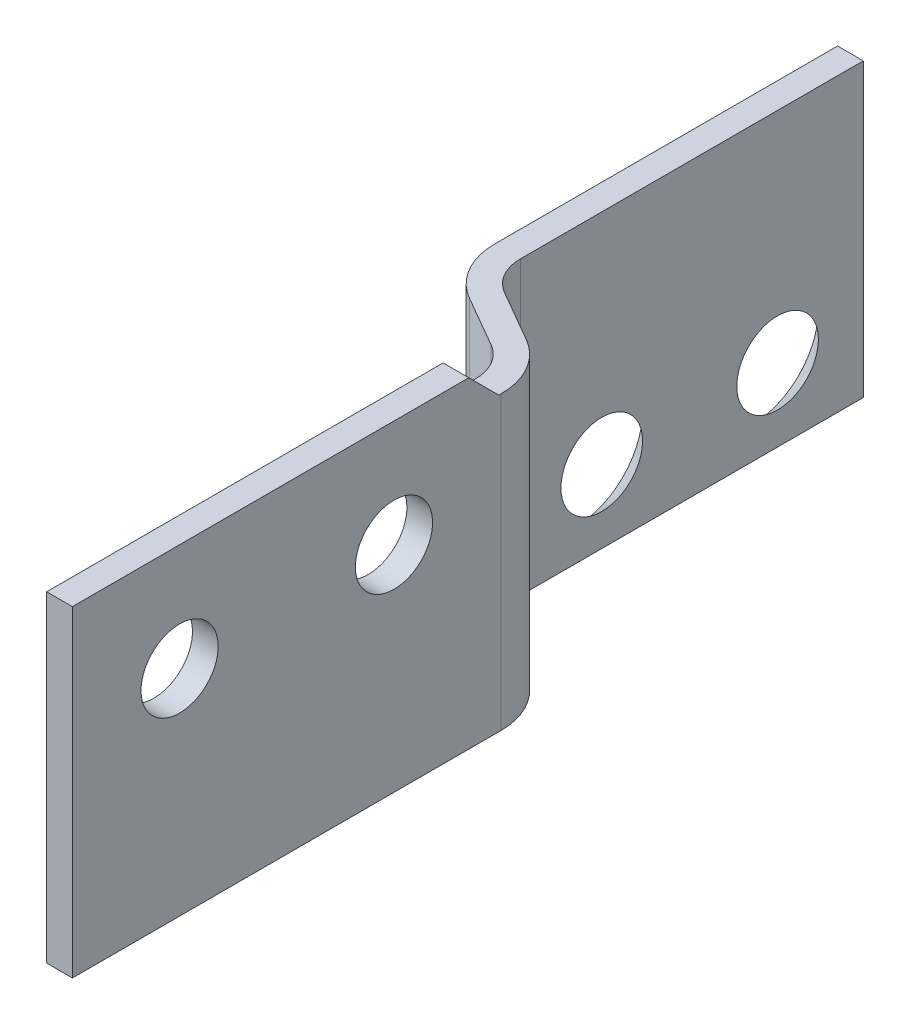
ISO-10303-21;
HEADER;
FILE_DESCRIPTION(('STEP AP214'),'2;1');
FILE_NAME('part.step','',(''),(''),'','','');
FILE_SCHEMA(('AUTOMOTIVE_DESIGN { 1 0 10303 214 1 1 1 1 }'));
ENDSEC;
DATA;
#1=APPLICATION_CONTEXT('core data for automotive mechanical design processes');
#2=APPLICATION_PROTOCOL_DEFINITION('international standard','automotive_design',2000,#1);
#3=PRODUCT_CONTEXT('',#1,'mechanical');
#4=PRODUCT('Part','Part','',(#3));
#5=PRODUCT_RELATED_PRODUCT_CATEGORY('part','',(#4));
#6=PRODUCT_DEFINITION_FORMATION('','',#4);
#7=PRODUCT_DEFINITION_CONTEXT('part definition',#1,'design');
#8=PRODUCT_DEFINITION('design','',#6,#7);
#9=PRODUCT_DEFINITION_SHAPE('','',#8);
#10=(LENGTH_UNIT() NAMED_UNIT(*) SI_UNIT(.MILLI.,.METRE.));
#11=(NAMED_UNIT(*) PLANE_ANGLE_UNIT() SI_UNIT($,.RADIAN.));
#12=(NAMED_UNIT(*) SI_UNIT($,.STERADIAN.) SOLID_ANGLE_UNIT());
#13=UNCERTAINTY_MEASURE_WITH_UNIT(LENGTH_MEASURE(1.E-05),#10,'distance_accuracy_value','');
#14=(GEOMETRIC_REPRESENTATION_CONTEXT(3) GLOBAL_UNCERTAINTY_ASSIGNED_CONTEXT((#13)) GLOBAL_UNIT_ASSIGNED_CONTEXT((#10,
#11,#12)) REPRESENTATION_CONTEXT('',''));
#15=CARTESIAN_POINT('',(0.,0.,0.));
#16=DIRECTION('',(0.,0.,1.));
#17=DIRECTION('',(1.,0.,0.));
#18=AXIS2_PLACEMENT_3D('',#15,#16,#17);
#19=CARTESIAN_POINT('',(2.,0.,10.07846096908));
#20=DIRECTION('',(-0.500000000000017,0.,0.866025403784429));
#21=DIRECTION('',(0.866025403784429,0.,0.500000000000017));
#22=AXIS2_PLACEMENT_3D('',#19,#20,#21);
#23=PLANE('',#22);
#24=DIRECTION('',(0.,-1.,0.));
#25=VECTOR('',#24,1.);
#26=CARTESIAN_POINT('',(1.99999999999759,0.,10.0784609690842));
#27=LINE('',#26,#25);
#28=CARTESIAN_POINT('',(2.00000000000001,0.,10.0784609690828));
#29=VERTEX_POINT('',#28);
#30=CARTESIAN_POINT('',(1.99999999999931,6.8,10.0784609690824));
#31=VERTEX_POINT('',#30);
#32=EDGE_CURVE('E187',#29,#31,#27,.F.);
#33=ORIENTED_EDGE('',*,*,#32,.T.);
#34=DIRECTION('',(-0.866025403785236,0.,-0.499999999998619));
#35=VECTOR('',#34,1.);
#36=CARTESIAN_POINT('',(2.,6.8,10.07846096908));
#37=LINE('',#36,#35);
#38=CARTESIAN_POINT('',(0.800000000001105,6.8,9.38564064605569));
#39=VERTEX_POINT('',#38);
#40=EDGE_CURVE('E203',#31,#39,#37,.T.);
#41=ORIENTED_EDGE('',*,*,#40,.T.);
#42=DIRECTION('',(0.,-1.,0.));
#43=VECTOR('',#42,1.);
#44=CARTESIAN_POINT('',(0.799999999999956,0.,9.38564064605508));
#45=LINE('',#44,#43);
#46=CARTESIAN_POINT('',(0.800000000000546,0.,9.38564064605407));
#47=VERTEX_POINT('',#46);
#48=EDGE_CURVE('E229',#47,#39,#45,.F.);
#49=ORIENTED_EDGE('',*,*,#48,.F.);
#50=DIRECTION('',(0.866025403784429,0.,0.500000000000017));
#51=VECTOR('',#50,1.);
#52=CARTESIAN_POINT('',(2.,0.,10.07846096908));
#53=LINE('',#52,#51);
#54=EDGE_CURVE('E237',#47,#29,#53,.T.);
#55=ORIENTED_EDGE('',*,*,#54,.T.);
#56=EDGE_LOOP('',(#33,#41,#49,#55));
#57=FACE_BOUND('',#56,.T.);
#58=ADVANCED_FACE('F17',(#57),#23,.T.);
#59=CARTESIAN_POINT('',(1.6,0.,8.));
#60=DIRECTION('',(0.,-1.,0.));
#61=DIRECTION('',(0.,0.,-1.));
#62=AXIS2_PLACEMENT_3D('',#59,#60,#61);
#63=CYLINDRICAL_SURFACE('',#62,1.6);
#64=ORIENTED_EDGE('',*,*,#48,.T.);
#65=CARTESIAN_POINT('',(1.6,6.8,8.));
#66=DIRECTION('',(0.,-1.,0.));
#67=DIRECTION('',(0.,0.,-1.));
#68=AXIS2_PLACEMENT_3D('',#65,#66,#67);
#69=CIRCLE('',#68,1.6);
#70=CARTESIAN_POINT('',(0.,6.8,8.));
#71=VERTEX_POINT('',#70);
#72=EDGE_CURVE('E205',#39,#71,#69,.T.);
#73=ORIENTED_EDGE('',*,*,#72,.T.);
#74=DIRECTION('',(0.,1.,0.));
#75=VECTOR('',#74,1.);
#76=CARTESIAN_POINT('',(0.,0.,8.));
#77=LINE('',#76,#75);
#78=CARTESIAN_POINT('',(0.,0.,8.));
#79=VERTEX_POINT('',#78);
#80=EDGE_CURVE('E181',#79,#71,#77,.T.);
#81=ORIENTED_EDGE('',*,*,#80,.F.);
#82=CARTESIAN_POINT('',(1.6,0.,8.));
#83=DIRECTION('',(0.,-1.,0.));
#84=DIRECTION('',(0.,0.,-1.));
#85=AXIS2_PLACEMENT_3D('',#82,#83,#84);
#86=CIRCLE('',#85,1.6);
#87=EDGE_CURVE('E20',#79,#47,#86,.F.);
#88=ORIENTED_EDGE('',*,*,#87,.T.);
#89=EDGE_LOOP('',(#64,#73,#81,#88));
#90=FACE_BOUND('',#89,.T.);
#91=ADVANCED_FACE('F332',(#90),#63,.T.);
#92=CARTESIAN_POINT('',(0.,0.,0.));
#93=DIRECTION('',(0.,0.,-1.));
#94=DIRECTION('',(-1.,0.,0.));
#95=AXIS2_PLACEMENT_3D('',#92,#93,#94);
#96=PLANE('',#95);
#97=DIRECTION('',(0.,1.,0.));
#98=VECTOR('',#97,1.);
#99=CARTESIAN_POINT('',(0.,0.,0.));
#100=LINE('',#99,#98);
#101=CARTESIAN_POINT('',(0.,6.8,0.));
#102=VERTEX_POINT('',#101);
#103=CARTESIAN_POINT('',(0.,0.,0.));
#104=VERTEX_POINT('',#103);
#105=EDGE_CURVE('E185',#102,#104,#100,.F.);
#106=ORIENTED_EDGE('',*,*,#105,.F.);
#107=DIRECTION('',(1.,0.,0.));
#108=VECTOR('',#107,1.);
#109=CARTESIAN_POINT('',(0.,6.8,0.));
#110=LINE('',#109,#108);
#111=CARTESIAN_POINT('',(0.6,6.8,0.));
#112=VERTEX_POINT('',#111);
#113=EDGE_CURVE('E223',#102,#112,#110,.T.);
#114=ORIENTED_EDGE('',*,*,#113,.T.);
#115=DIRECTION('',(0.,1.,0.));
#116=VECTOR('',#115,1.);
#117=CARTESIAN_POINT('',(0.6,0.,0.));
#118=LINE('',#117,#116);
#119=CARTESIAN_POINT('',(0.6,0.,0.));
#120=VERTEX_POINT('',#119);
#121=EDGE_CURVE('E174',#120,#112,#118,.T.);
#122=ORIENTED_EDGE('',*,*,#121,.F.);
#123=DIRECTION('',(-1.,0.,0.));
#124=VECTOR('',#123,1.);
#125=CARTESIAN_POINT('',(0.,0.,0.));
#126=LINE('',#125,#124);
#127=EDGE_CURVE('E100',#120,#104,#126,.T.);
#128=ORIENTED_EDGE('',*,*,#127,.T.);
#129=EDGE_LOOP('',(#106,#114,#122,#128));
#130=FACE_BOUND('',#129,.T.);
#131=ADVANCED_FACE('F398',(#130),#96,.T.);
#132=CARTESIAN_POINT('',(0.,6.8,0.));
#133=DIRECTION('',(0.,-1.,0.));
#134=DIRECTION('',(0.,0.,-1.));
#135=AXIS2_PLACEMENT_3D('',#132,#133,#134);
#136=PLANE('',#135);
#137=DIRECTION('',(0.,0.,-1.));
#138=VECTOR('',#137,1.);
#139=CARTESIAN_POINT('',(0.6,6.8,0.));
#140=LINE('',#139,#138);
#141=CARTESIAN_POINT('',(0.6,6.8,8.));
#142=VERTEX_POINT('',#141);
#143=EDGE_CURVE('E178',#112,#142,#140,.F.);
#144=ORIENTED_EDGE('',*,*,#143,.F.);
#145=ORIENTED_EDGE('',*,*,#113,.F.);
#146=DIRECTION('',(0.,0.,1.));
#147=VECTOR('',#146,1.);
#148=CARTESIAN_POINT('',(0.,6.8,8.));
#149=LINE('',#148,#147);
#150=EDGE_CURVE('E184',#71,#102,#149,.F.);
#151=ORIENTED_EDGE('',*,*,#150,.F.);
#152=ORIENTED_EDGE('',*,*,#72,.F.);
#153=ORIENTED_EDGE('',*,*,#40,.F.);
#154=CARTESIAN_POINT('',(1.5,6.8,10.94448637287));
#155=DIRECTION('',(0.,-1.,0.));
#156=DIRECTION('',(0.,0.,-1.));
#157=AXIS2_PLACEMENT_3D('',#154,#155,#156);
#158=CIRCLE('',#157,1.);
#159=CARTESIAN_POINT('',(2.5,6.8,10.94448637287));
#160=VERTEX_POINT('',#159);
#161=EDGE_CURVE('E266',#31,#160,#158,.T.);
#162=ORIENTED_EDGE('',*,*,#161,.T.);
#163=DIRECTION('',(0.,0.,-1.));
#164=VECTOR('',#163,1.);
#165=CARTESIAN_POINT('',(2.5,6.8,0.));
#166=LINE('',#165,#164);
#167=CARTESIAN_POINT('',(2.5,6.8,11.));
#168=VERTEX_POINT('',#167);
#169=EDGE_CURVE('E206',#168,#160,#166,.T.);
#170=ORIENTED_EDGE('',*,*,#169,.F.);
#171=DIRECTION('',(1.,0.,0.));
#172=VECTOR('',#171,1.);
#173=CARTESIAN_POINT('',(0.,6.8,11.));
#174=LINE('',#173,#172);
#175=CARTESIAN_POINT('',(3.1,6.8,11.));
#176=VERTEX_POINT('',#175);
#177=EDGE_CURVE('E208',#176,#168,#174,.F.);
#178=ORIENTED_EDGE('',*,*,#177,.F.);
#179=DIRECTION('',(0.,0.,-1.));
#180=VECTOR('',#179,1.);
#181=CARTESIAN_POINT('',(3.1,6.8,0.));
#182=LINE('',#181,#180);
#183=CARTESIAN_POINT('',(3.1,6.8,10.94448637287));
#184=VERTEX_POINT('',#183);
#185=EDGE_CURVE('E211',#184,#176,#182,.F.);
#186=ORIENTED_EDGE('',*,*,#185,.F.);
#187=CARTESIAN_POINT('',(1.5,6.8,10.94448637287));
#188=DIRECTION('',(0.,-1.,0.));
#189=DIRECTION('',(0.,0.,-1.));
#190=AXIS2_PLACEMENT_3D('',#187,#188,#189);
#191=CIRCLE('',#190,1.6);
#192=CARTESIAN_POINT('',(2.3000000000002,6.8,9.55884572681356));
#193=VERTEX_POINT('',#192);
#194=EDGE_CURVE('E213',#193,#184,#191,.T.);
#195=ORIENTED_EDGE('',*,*,#194,.F.);
#196=DIRECTION('',(0.866025403784298,0.,0.500000000000243));
#197=VECTOR('',#196,1.);
#198=CARTESIAN_POINT('',(1.1,6.8,8.866025403784));
#199=LINE('',#198,#197);
#200=CARTESIAN_POINT('',(1.09999999999997,6.8,8.86602540378398));
#201=VERTEX_POINT('',#200);
#202=EDGE_CURVE('E216',#201,#193,#199,.T.);
#203=ORIENTED_EDGE('',*,*,#202,.F.);
#204=CARTESIAN_POINT('',(1.6,6.8,8.));
#205=DIRECTION('',(0.,-1.,0.));
#206=DIRECTION('',(0.,0.,-1.));
#207=AXIS2_PLACEMENT_3D('',#204,#205,#206);
#208=CIRCLE('',#207,1.);
#209=EDGE_CURVE('E225',#201,#142,#208,.T.);
#210=ORIENTED_EDGE('',*,*,#209,.T.);
#211=EDGE_LOOP('',(#144,#145,#151,#152,#153,#162,#170,#178,#186,#195,#203,#210));
#212=FACE_BOUND('',#211,.T.);
#213=ADVANCED_FACE('F281',(#212),#136,.F.);
#214=CARTESIAN_POINT('',(0.000901587725365971,1.7,2.));
#215=DIRECTION('',(-1.,0.,0.));
#216=DIRECTION('',(0.,0.,1.));
#217=AXIS2_PLACEMENT_3D('',#214,#215,#216);
#218=CONICAL_SURFACE('',#217,1.5508943024447,0.785977484061561);
#219=CARTESIAN_POINT('',(0.,1.7,2.));
#220=DIRECTION('',(-1.,0.,0.));
#221=DIRECTION('',(0.,0.,1.));
#222=AXIS2_PLACEMENT_3D('',#219,#220,#221);
#223=CIRCLE('',#222,1.5517969353925);
#224=CARTESIAN_POINT('',(0.,1.7,3.55179693539251));
#225=VERTEX_POINT('',#224);
#226=EDGE_CURVE('E234',#225,#225,#223,.F.);
#227=ORIENTED_EDGE('',*,*,#226,.F.);
#228=EDGE_LOOP('',(#227));
#229=FACE_BOUND('',#228,.T.);
#230=CARTESIAN_POINT('',(0.600000000019918,1.7,2.));
#231=DIRECTION('',(-1.,0.,0.));
#232=DIRECTION('',(0.,0.,1.));
#233=AXIS2_PLACEMENT_3D('',#230,#231,#232);
#234=CIRCLE('',#233,0.951101347529402);
#235=CARTESIAN_POINT('',(0.600000000019918,1.7,2.9511013475294));
#236=VERTEX_POINT('',#235);
#237=EDGE_CURVE('E220',#236,#236,#234,.T.);
#238=ORIENTED_EDGE('',*,*,#237,.F.);
#239=EDGE_LOOP('',(#238));
#240=FACE_BOUND('',#239,.T.);
#241=ADVANCED_FACE('F388',(#229,#240),#218,.F.);
#242=CARTESIAN_POINT('',(0.000901587668522552,1.7,6.1));
#243=DIRECTION('',(-1.,0.,0.));
#244=DIRECTION('',(0.,0.,1.));
#245=AXIS2_PLACEMENT_3D('',#242,#243,#244);
#246=CONICAL_SURFACE('',#245,1.55089430250755,0.785977484061396);
#247=CARTESIAN_POINT('',(0.,1.7,6.1));
#248=DIRECTION('',(-1.,0.,0.));
#249=DIRECTION('',(0.,0.,1.));
#250=AXIS2_PLACEMENT_3D('',#247,#248,#249);
#251=CIRCLE('',#250,1.55179693539844);
#252=CARTESIAN_POINT('',(0.,1.7,7.65179693539844));
#253=VERTEX_POINT('',#252);
#254=EDGE_CURVE('E175',#253,#253,#251,.F.);
#255=ORIENTED_EDGE('',*,*,#254,.F.);
#256=EDGE_LOOP('',(#255));
#257=FACE_BOUND('',#256,.T.);
#258=CARTESIAN_POINT('',(0.600000000076827,1.7,6.1));
#259=DIRECTION('',(-1.,0.,0.));
#260=DIRECTION('',(0.,0.,1.));
#261=AXIS2_PLACEMENT_3D('',#258,#259,#260);
#262=CIRCLE('',#261,0.951101347478561);
#263=CARTESIAN_POINT('',(0.600000000076827,1.7,7.05110134747856));
#264=VERTEX_POINT('',#263);
#265=EDGE_CURVE('E170',#264,#264,#262,.T.);
#266=ORIENTED_EDGE('',*,*,#265,.F.);
#267=EDGE_LOOP('',(#266));
#268=FACE_BOUND('',#267,.T.);
#269=ADVANCED_FACE('F348',(#257,#268),#246,.F.);
#270=CARTESIAN_POINT('',(1.6,0.,8.));
#271=DIRECTION('',(0.,-1.,0.));
#272=DIRECTION('',(0.,0.,-1.));
#273=AXIS2_PLACEMENT_3D('',#270,#271,#272);
#274=CYLINDRICAL_SURFACE('',#273,1.);
#275=CARTESIAN_POINT('',(1.6,0.,8.));
#276=DIRECTION('',(0.,-1.,0.));
#277=DIRECTION('',(0.,0.,-1.));
#278=AXIS2_PLACEMENT_3D('',#275,#276,#277);
#279=CIRCLE('',#278,1.);
#280=CARTESIAN_POINT('',(0.6,0.,8.));
#281=VERTEX_POINT('',#280);
#282=CARTESIAN_POINT('',(1.09999999999997,0.,8.86602540378398));
#283=VERTEX_POINT('',#282);
#284=EDGE_CURVE('E269',#281,#283,#279,.F.);
#285=ORIENTED_EDGE('',*,*,#284,.F.);
#286=DIRECTION('',(0.,1.,0.));
#287=VECTOR('',#286,1.);
#288=CARTESIAN_POINT('',(0.6,0.,8.));
#289=LINE('',#288,#287);
#290=EDGE_CURVE('E171',#142,#281,#289,.F.);
#291=ORIENTED_EDGE('',*,*,#290,.F.);
#292=ORIENTED_EDGE('',*,*,#209,.F.);
#293=DIRECTION('',(0.,1.,0.));
#294=VECTOR('',#293,1.);
#295=CARTESIAN_POINT('',(1.1,0.,8.866025403784));
#296=LINE('',#295,#294);
#297=EDGE_CURVE('E166',#283,#201,#296,.T.);
#298=ORIENTED_EDGE('',*,*,#297,.F.);
#299=EDGE_LOOP('',(#285,#291,#292,#298));
#300=FACE_BOUND('',#299,.T.);
#301=ADVANCED_FACE('F321',(#300),#274,.F.);
#302=CARTESIAN_POINT('',(1.5,0.,10.94448637287));
#303=DIRECTION('',(0.,-1.,0.));
#304=DIRECTION('',(0.,0.,-1.));
#305=AXIS2_PLACEMENT_3D('',#302,#303,#304);
#306=CYLINDRICAL_SURFACE('',#305,1.);
#307=CARTESIAN_POINT('',(1.5,0.,10.94448637287));
#308=DIRECTION('',(0.,-1.,0.));
#309=DIRECTION('',(0.,0.,-1.));
#310=AXIS2_PLACEMENT_3D('',#307,#308,#309);
#311=CIRCLE('',#310,1.);
#312=CARTESIAN_POINT('',(2.5,0.,10.94448637287));
#313=VERTEX_POINT('',#312);
#314=EDGE_CURVE('E242',#313,#29,#311,.F.);
#315=ORIENTED_EDGE('',*,*,#314,.F.);
#316=DIRECTION('',(0.,1.,0.));
#317=VECTOR('',#316,1.);
#318=CARTESIAN_POINT('',(2.5,0.,10.94448637287));
#319=LINE('',#318,#317);
#320=EDGE_CURVE('E169',#160,#313,#319,.F.);
#321=ORIENTED_EDGE('',*,*,#320,.F.);
#322=ORIENTED_EDGE('',*,*,#161,.F.);
#323=ORIENTED_EDGE('',*,*,#32,.F.);
#324=EDGE_LOOP('',(#315,#321,#322,#323));
#325=FACE_BOUND('',#324,.T.);
#326=ADVANCED_FACE('F338',(#325),#306,.F.);
#327=CARTESIAN_POINT('',(0.,0.,8.));
#328=DIRECTION('',(-1.,0.,0.));
#329=DIRECTION('',(0.,0.,1.));
#330=AXIS2_PLACEMENT_3D('',#327,#328,#329);
#331=PLANE('',#330);
#332=ORIENTED_EDGE('',*,*,#254,.T.);
#333=EDGE_LOOP('',(#332));
#334=FACE_BOUND('',#333,.T.);
#335=ORIENTED_EDGE('',*,*,#226,.T.);
#336=EDGE_LOOP('',(#335));
#337=FACE_BOUND('',#336,.T.);
#338=ORIENTED_EDGE('',*,*,#80,.T.);
#339=ORIENTED_EDGE('',*,*,#150,.T.);
#340=ORIENTED_EDGE('',*,*,#105,.T.);
#341=DIRECTION('',(0.,0.,-1.));
#342=VECTOR('',#341,1.);
#343=CARTESIAN_POINT('',(0.,0.,0.));
#344=LINE('',#343,#342);
#345=EDGE_CURVE('E292',#79,#104,#344,.T.);
#346=ORIENTED_EDGE('',*,*,#345,.F.);
#347=EDGE_LOOP('',(#338,#339,#340,#346));
#348=FACE_BOUND('',#347,.T.);
#349=ADVANCED_FACE('F329',(#334,#337,#348),#331,.T.);
#350=CARTESIAN_POINT('',(0.6,0.,0.));
#351=DIRECTION('',(1.,0.,0.));
#352=DIRECTION('',(0.,0.,-1.));
#353=AXIS2_PLACEMENT_3D('',#350,#351,#352);
#354=PLANE('',#353);
#355=ORIENTED_EDGE('',*,*,#265,.T.);
#356=EDGE_LOOP('',(#355));
#357=FACE_BOUND('',#356,.T.);
#358=ORIENTED_EDGE('',*,*,#237,.T.);
#359=EDGE_LOOP('',(#358));
#360=FACE_BOUND('',#359,.T.);
#361=ORIENTED_EDGE('',*,*,#121,.T.);
#362=ORIENTED_EDGE('',*,*,#143,.T.);
#363=ORIENTED_EDGE('',*,*,#290,.T.);
#364=DIRECTION('',(0.,0.,-1.));
#365=VECTOR('',#364,1.);
#366=CARTESIAN_POINT('',(0.6,0.,0.));
#367=LINE('',#366,#365);
#368=EDGE_CURVE('E309',#120,#281,#367,.F.);
#369=ORIENTED_EDGE('',*,*,#368,.F.);
#370=EDGE_LOOP('',(#361,#362,#363,#369));
#371=FACE_BOUND('',#370,.T.);
#372=ADVANCED_FACE('F324',(#357,#360,#371),#354,.T.);
#373=CARTESIAN_POINT('',(1.1,0.,8.866025403784));
#374=DIRECTION('',(0.500000000000017,0.,-0.866025403784429));
#375=DIRECTION('',(-0.866025403784429,0.,-0.500000000000017));
#376=AXIS2_PLACEMENT_3D('',#373,#374,#375);
#377=PLANE('',#376);
#378=ORIENTED_EDGE('',*,*,#297,.T.);
#379=ORIENTED_EDGE('',*,*,#202,.T.);
#380=DIRECTION('',(0.,-1.,0.));
#381=VECTOR('',#380,1.);
#382=CARTESIAN_POINT('',(2.29999999999875,0.,9.55884572681417));
#383=LINE('',#382,#381);
#384=CARTESIAN_POINT('',(2.3000000000002,0.,9.55884572681356));
#385=VERTEX_POINT('',#384);
#386=EDGE_CURVE('E162',#385,#193,#383,.F.);
#387=ORIENTED_EDGE('',*,*,#386,.F.);
#388=DIRECTION('',(0.866025403784298,0.,0.500000000000243));
#389=VECTOR('',#388,1.);
#390=CARTESIAN_POINT('',(1.1,0.,8.866025403784));
#391=LINE('',#390,#389);
#392=EDGE_CURVE('E256',#283,#385,#391,.T.);
#393=ORIENTED_EDGE('',*,*,#392,.F.);
#394=EDGE_LOOP('',(#378,#379,#387,#393));
#395=FACE_BOUND('',#394,.T.);
#396=ADVANCED_FACE('F317',(#395),#377,.T.);
#397=CARTESIAN_POINT('',(2.5,0.,20.94448637287));
#398=DIRECTION('',(-1.,0.,0.));
#399=DIRECTION('',(0.,0.,1.));
#400=AXIS2_PLACEMENT_3D('',#397,#398,#399);
#401=PLANE('',#400);
#402=CARTESIAN_POINT('',(2.5,5.,13.44448637287));
#403=DIRECTION('',(-1.,0.,0.));
#404=DIRECTION('',(0.,0.,1.));
#405=AXIS2_PLACEMENT_3D('',#402,#403,#404);
#406=CIRCLE('',#405,0.9);
#407=CARTESIAN_POINT('',(2.5,5.,14.34448637287));
#408=VERTEX_POINT('',#407);
#409=EDGE_CURVE('E149',#408,#408,#406,.F.);
#410=ORIENTED_EDGE('',*,*,#409,.T.);
#411=EDGE_LOOP('',(#410));
#412=FACE_BOUND('',#411,.T.);
#413=CARTESIAN_POINT('',(2.5,5.,18.44448637287));
#414=DIRECTION('',(-1.,0.,0.));
#415=DIRECTION('',(0.,0.,1.));
#416=AXIS2_PLACEMENT_3D('',#413,#414,#415);
#417=CIRCLE('',#416,0.9);
#418=CARTESIAN_POINT('',(2.5,5.,19.34448637287));
#419=VERTEX_POINT('',#418);
#420=EDGE_CURVE('E165',#419,#419,#417,.F.);
#421=ORIENTED_EDGE('',*,*,#420,.T.);
#422=EDGE_LOOP('',(#421));
#423=FACE_BOUND('',#422,.T.);
#424=DIRECTION('',(0.,-0.707106781186548,-0.707106781186548));
#425=VECTOR('',#424,1.);
#426=CARTESIAN_POINT('',(2.5,6.8,11.));
#427=LINE('',#426,#425);
#428=CARTESIAN_POINT('',(2.5,7.5,11.7));
#429=VERTEX_POINT('',#428);
#430=EDGE_CURVE('E192',#429,#168,#427,.T.);
#431=ORIENTED_EDGE('',*,*,#430,.T.);
#432=ORIENTED_EDGE('',*,*,#169,.T.);
#433=ORIENTED_EDGE('',*,*,#320,.T.);
#434=DIRECTION('',(0.,0.,-1.));
#435=VECTOR('',#434,1.);
#436=CARTESIAN_POINT('',(2.5,0.,0.));
#437=LINE('',#436,#435);
#438=CARTESIAN_POINT('',(2.5,0.,20.94448637287));
#439=VERTEX_POINT('',#438);
#440=EDGE_CURVE('E290',#439,#313,#437,.T.);
#441=ORIENTED_EDGE('',*,*,#440,.F.);
#442=DIRECTION('',(0.,1.,0.));
#443=VECTOR('',#442,1.);
#444=CARTESIAN_POINT('',(2.5,0.,20.94448637287));
#445=LINE('',#444,#443);
#446=CARTESIAN_POINT('',(2.5,7.5,20.94448637287));
#447=VERTEX_POINT('',#446);
#448=EDGE_CURVE('E134',#447,#439,#445,.F.);
#449=ORIENTED_EDGE('',*,*,#448,.F.);
#450=DIRECTION('',(0.,0.,-1.));
#451=VECTOR('',#450,1.);
#452=CARTESIAN_POINT('',(2.5,7.5,11.7));
#453=LINE('',#452,#451);
#454=EDGE_CURVE('E131',#447,#429,#453,.T.);
#455=ORIENTED_EDGE('',*,*,#454,.T.);
#456=EDGE_LOOP('',(#431,#432,#433,#441,#449,#455));
#457=FACE_BOUND('',#456,.T.);
#458=ADVANCED_FACE('F287',(#412,#423,#457),#401,.T.);
#459=CARTESIAN_POINT('',(0.,6.8,11.));
#460=DIRECTION('',(0.,-0.707106781186548,0.707106781186548));
#461=DIRECTION('',(0.,-0.707106781186548,-0.707106781186548));
#462=AXIS2_PLACEMENT_3D('',#459,#460,#461);
#463=PLANE('',#462);
#464=ORIENTED_EDGE('',*,*,#430,.F.);
#465=DIRECTION('',(1.,0.,0.));
#466=VECTOR('',#465,1.);
#467=CARTESIAN_POINT('',(0.,7.5,11.7));
#468=LINE('',#467,#466);
#469=CARTESIAN_POINT('',(3.1,7.5,11.7));
#470=VERTEX_POINT('',#469);
#471=EDGE_CURVE('E156',#429,#470,#468,.T.);
#472=ORIENTED_EDGE('',*,*,#471,.T.);
#473=DIRECTION('',(0.,0.707106781186547,0.707106781186548));
#474=VECTOR('',#473,1.);
#475=CARTESIAN_POINT('',(3.1,6.8,11.));
#476=LINE('',#475,#474);
#477=EDGE_CURVE('E147',#176,#470,#476,.T.);
#478=ORIENTED_EDGE('',*,*,#477,.F.);
#479=ORIENTED_EDGE('',*,*,#177,.T.);
#480=EDGE_LOOP('',(#464,#472,#478,#479));
#481=FACE_BOUND('',#480,.T.);
#482=ADVANCED_FACE('F285',(#481),#463,.F.);
#483=CARTESIAN_POINT('',(0.,7.5,11.7));
#484=DIRECTION('',(0.,-1.,0.));
#485=DIRECTION('',(0.,0.,-1.));
#486=AXIS2_PLACEMENT_3D('',#483,#484,#485);
#487=PLANE('',#486);
#488=ORIENTED_EDGE('',*,*,#454,.F.);
#489=DIRECTION('',(1.,0.,0.));
#490=VECTOR('',#489,1.);
#491=CARTESIAN_POINT('',(3.1,7.5,20.94448637287));
#492=LINE('',#491,#490);
#493=CARTESIAN_POINT('',(3.1,7.5,20.94448637287));
#494=VERTEX_POINT('',#493);
#495=EDGE_CURVE('E124',#494,#447,#492,.F.);
#496=ORIENTED_EDGE('',*,*,#495,.F.);
#497=DIRECTION('',(0.,0.,-1.));
#498=VECTOR('',#497,1.);
#499=CARTESIAN_POINT('',(3.1,7.5,10.94448637287));
#500=LINE('',#499,#498);
#501=EDGE_CURVE('E129',#470,#494,#500,.F.);
#502=ORIENTED_EDGE('',*,*,#501,.F.);
#503=ORIENTED_EDGE('',*,*,#471,.F.);
#504=EDGE_LOOP('',(#488,#496,#502,#503));
#505=FACE_BOUND('',#504,.T.);
#506=ADVANCED_FACE('F126',(#505),#487,.F.);
#507=CARTESIAN_POINT('',(3.1,0.,20.94448637287));
#508=DIRECTION('',(0.,0.,1.));
#509=DIRECTION('',(1.,0.,0.));
#510=AXIS2_PLACEMENT_3D('',#507,#508,#509);
#511=PLANE('',#510);
#512=DIRECTION('',(0.,1.,0.));
#513=VECTOR('',#512,1.);
#514=CARTESIAN_POINT('',(3.1,0.,20.94448637287));
#515=LINE('',#514,#513);
#516=CARTESIAN_POINT('',(3.1,0.,20.94448637287));
#517=VERTEX_POINT('',#516);
#518=EDGE_CURVE('E137',#494,#517,#515,.F.);
#519=ORIENTED_EDGE('',*,*,#518,.F.);
#520=ORIENTED_EDGE('',*,*,#495,.T.);
#521=ORIENTED_EDGE('',*,*,#448,.T.);
#522=DIRECTION('',(1.,0.,0.));
#523=VECTOR('',#522,1.);
#524=CARTESIAN_POINT('',(0.,0.,20.94448637287));
#525=LINE('',#524,#523);
#526=EDGE_CURVE('E133',#517,#439,#525,.F.);
#527=ORIENTED_EDGE('',*,*,#526,.F.);
#528=EDGE_LOOP('',(#519,#520,#521,#527));
#529=FACE_BOUND('',#528,.T.);
#530=ADVANCED_FACE('F138',(#529),#511,.T.);
#531=CARTESIAN_POINT('',(0.,0.,0.));
#532=DIRECTION('',(0.,-1.,0.));
#533=DIRECTION('',(0.,0.,-1.));
#534=AXIS2_PLACEMENT_3D('',#531,#532,#533);
#535=PLANE('',#534);
#536=ORIENTED_EDGE('',*,*,#284,.T.);
#537=ORIENTED_EDGE('',*,*,#392,.T.);
#538=CARTESIAN_POINT('',(1.5,0.,10.94448637287));
#539=DIRECTION('',(0.,-1.,0.));
#540=DIRECTION('',(0.,0.,-1.));
#541=AXIS2_PLACEMENT_3D('',#538,#539,#540);
#542=CIRCLE('',#541,1.6);
#543=CARTESIAN_POINT('',(3.1,0.,10.94448637287));
#544=VERTEX_POINT('',#543);
#545=EDGE_CURVE('E35',#544,#385,#542,.F.);
#546=ORIENTED_EDGE('',*,*,#545,.F.);
#547=DIRECTION('',(0.,0.,-1.));
#548=VECTOR('',#547,1.);
#549=CARTESIAN_POINT('',(3.1,0.,10.94448637287));
#550=LINE('',#549,#548);
#551=EDGE_CURVE('E142',#517,#544,#550,.T.);
#552=ORIENTED_EDGE('',*,*,#551,.F.);
#553=ORIENTED_EDGE('',*,*,#526,.T.);
#554=ORIENTED_EDGE('',*,*,#440,.T.);
#555=ORIENTED_EDGE('',*,*,#314,.T.);
#556=ORIENTED_EDGE('',*,*,#54,.F.);
#557=ORIENTED_EDGE('',*,*,#87,.F.);
#558=ORIENTED_EDGE('',*,*,#345,.T.);
#559=ORIENTED_EDGE('',*,*,#127,.F.);
#560=ORIENTED_EDGE('',*,*,#368,.T.);
#561=EDGE_LOOP('',(#536,#537,#546,#552,#553,#554,#555,#556,#557,#558,#559,#560));
#562=FACE_BOUND('',#561,.T.);
#563=ADVANCED_FACE('F294',(#562),#535,.T.);
#564=CARTESIAN_POINT('',(1.5,0.,10.94448637287));
#565=DIRECTION('',(0.,-1.,0.));
#566=DIRECTION('',(0.,0.,-1.));
#567=AXIS2_PLACEMENT_3D('',#564,#565,#566);
#568=CYLINDRICAL_SURFACE('',#567,1.6);
#569=ORIENTED_EDGE('',*,*,#386,.T.);
#570=ORIENTED_EDGE('',*,*,#194,.T.);
#571=DIRECTION('',(0.,1.,0.));
#572=VECTOR('',#571,1.);
#573=CARTESIAN_POINT('',(3.1,0.,10.94448637287));
#574=LINE('',#573,#572);
#575=EDGE_CURVE('E250',#544,#184,#574,.T.);
#576=ORIENTED_EDGE('',*,*,#575,.F.);
#577=ORIENTED_EDGE('',*,*,#545,.T.);
#578=EDGE_LOOP('',(#569,#570,#576,#577));
#579=FACE_BOUND('',#578,.T.);
#580=ADVANCED_FACE('F274',(#579),#568,.T.);
#581=CARTESIAN_POINT('',(2.5,5.,18.44448637287));
#582=DIRECTION('',(-1.,0.,0.));
#583=DIRECTION('',(0.,0.,1.));
#584=AXIS2_PLACEMENT_3D('',#581,#582,#583);
#585=CYLINDRICAL_SURFACE('',#584,0.9);
#586=ORIENTED_EDGE('',*,*,#420,.F.);
#587=EDGE_LOOP('',(#586));
#588=FACE_BOUND('',#587,.T.);
#589=CARTESIAN_POINT('',(3.1,5.,18.44448637287));
#590=DIRECTION('',(-1.,0.,0.));
#591=DIRECTION('',(0.,0.,1.));
#592=AXIS2_PLACEMENT_3D('',#589,#590,#591);
#593=CIRCLE('',#592,0.9);
#594=CARTESIAN_POINT('',(3.1,5.,19.34448637287));
#595=VERTEX_POINT('',#594);
#596=EDGE_CURVE('E26',#595,#595,#593,.T.);
#597=ORIENTED_EDGE('',*,*,#596,.F.);
#598=EDGE_LOOP('',(#597));
#599=FACE_BOUND('',#598,.T.);
#600=ADVANCED_FACE('F357',(#588,#599),#585,.F.);
#601=CARTESIAN_POINT('',(2.5,5.,13.44448637287));
#602=DIRECTION('',(-1.,0.,0.));
#603=DIRECTION('',(0.,0.,1.));
#604=AXIS2_PLACEMENT_3D('',#601,#602,#603);
#605=CYLINDRICAL_SURFACE('',#604,0.9);
#606=CARTESIAN_POINT('',(3.1,5.,13.44448637287));
#607=DIRECTION('',(-1.,0.,0.));
#608=DIRECTION('',(0.,0.,1.));
#609=AXIS2_PLACEMENT_3D('',#606,#607,#608);
#610=CIRCLE('',#609,0.9);
#611=CARTESIAN_POINT('',(3.1,5.,14.34448637287));
#612=VERTEX_POINT('',#611);
#613=EDGE_CURVE('E11',#612,#612,#610,.T.);
#614=ORIENTED_EDGE('',*,*,#613,.F.);
#615=EDGE_LOOP('',(#614));
#616=FACE_BOUND('',#615,.T.);
#617=ORIENTED_EDGE('',*,*,#409,.F.);
#618=EDGE_LOOP('',(#617));
#619=FACE_BOUND('',#618,.T.);
#620=ADVANCED_FACE('F351',(#616,#619),#605,.F.);
#621=CARTESIAN_POINT('',(3.1,0.,10.94448637287));
#622=DIRECTION('',(1.,0.,0.));
#623=DIRECTION('',(0.,0.,-1.));
#624=AXIS2_PLACEMENT_3D('',#621,#622,#623);
#625=PLANE('',#624);
#626=ORIENTED_EDGE('',*,*,#613,.T.);
#627=EDGE_LOOP('',(#626));
#628=FACE_BOUND('',#627,.T.);
#629=ORIENTED_EDGE('',*,*,#596,.T.);
#630=EDGE_LOOP('',(#629));
#631=FACE_BOUND('',#630,.T.);
#632=ORIENTED_EDGE('',*,*,#575,.T.);
#633=ORIENTED_EDGE('',*,*,#185,.T.);
#634=ORIENTED_EDGE('',*,*,#477,.T.);
#635=ORIENTED_EDGE('',*,*,#501,.T.);
#636=ORIENTED_EDGE('',*,*,#518,.T.);
#637=ORIENTED_EDGE('',*,*,#551,.T.);
#638=EDGE_LOOP('',(#632,#633,#634,#635,#636,#637));
#639=FACE_BOUND('',#638,.T.);
#640=ADVANCED_FACE('F145',(#628,#631,#639),#625,.T.);
#641=CLOSED_SHELL('',(#58,#91,#131,#213,#241,#269,#301,#326,#349,#372,#396,#458,#482,#506,#530,
#563,#580,#600,#620,#640));
#642=MANIFOLD_SOLID_BREP('B1',#641);
#643=ADVANCED_BREP_SHAPE_REPRESENTATION('',(#18,#642),#14);
#644=SHAPE_DEFINITION_REPRESENTATION(#9,#643);
ENDSEC;
END-ISO-10303-21;
